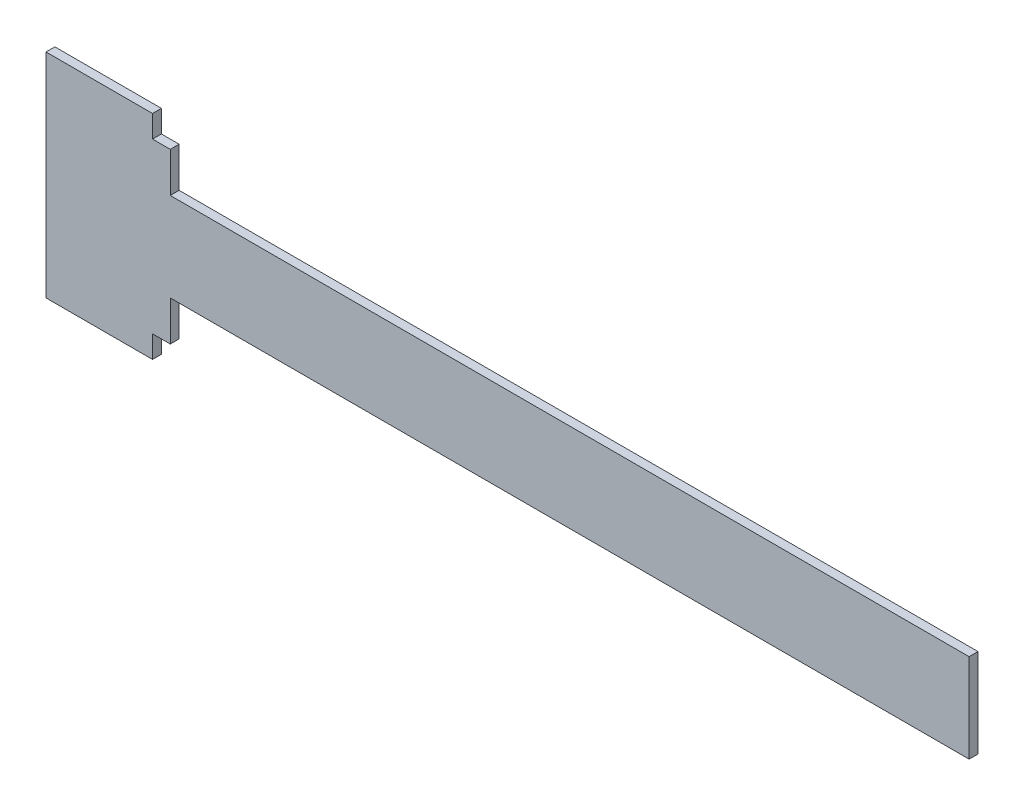
ISO-10303-21;
HEADER;
FILE_DESCRIPTION(('STEP AP214'),'2;1');
FILE_NAME('part.step','',(''),(''),'','','');
FILE_SCHEMA(('AUTOMOTIVE_DESIGN { 1 0 10303 214 1 1 1 1 }'));
ENDSEC;
DATA;
#1=APPLICATION_CONTEXT('core data for automotive mechanical design processes');
#2=APPLICATION_PROTOCOL_DEFINITION('international standard','automotive_design',2000,#1);
#3=PRODUCT_CONTEXT('',#1,'mechanical');
#4=PRODUCT('Part','Part','',(#3));
#5=PRODUCT_RELATED_PRODUCT_CATEGORY('part','',(#4));
#6=PRODUCT_DEFINITION_FORMATION('','',#4);
#7=PRODUCT_DEFINITION_CONTEXT('part definition',#1,'design');
#8=PRODUCT_DEFINITION('design','',#6,#7);
#9=PRODUCT_DEFINITION_SHAPE('','',#8);
#10=(LENGTH_UNIT() NAMED_UNIT(*) SI_UNIT(.MILLI.,.METRE.));
#11=(NAMED_UNIT(*) PLANE_ANGLE_UNIT() SI_UNIT($,.RADIAN.));
#12=(NAMED_UNIT(*) SI_UNIT($,.STERADIAN.) SOLID_ANGLE_UNIT());
#13=UNCERTAINTY_MEASURE_WITH_UNIT(LENGTH_MEASURE(1.E-05),#10,'distance_accuracy_value','');
#14=(GEOMETRIC_REPRESENTATION_CONTEXT(3) GLOBAL_UNCERTAINTY_ASSIGNED_CONTEXT((#13)) GLOBAL_UNIT_ASSIGNED_CONTEXT((#10,
#11,#12)) REPRESENTATION_CONTEXT('',''));
#15=CARTESIAN_POINT('',(0.,0.,0.));
#16=DIRECTION('',(0.,0.,1.));
#17=DIRECTION('',(1.,0.,0.));
#18=AXIS2_PLACEMENT_3D('',#15,#16,#17);
#19=CARTESIAN_POINT('',(-66.9761214574588,6.0224358974359,1.));
#20=DIRECTION('',(-1.,0.,0.));
#21=DIRECTION('',(0.,-1.,0.));
#22=AXIS2_PLACEMENT_3D('',#19,#20,#21);
#23=PLANE('',#22);
#24=DIRECTION('',(0.,1.,0.));
#25=VECTOR('',#24,1.);
#26=CARTESIAN_POINT('',(-66.9761214574588,6.0224358974359,0.));
#27=LINE('',#26,#25);
#28=CARTESIAN_POINT('',(-66.9761214574588,1.5224358974359,0.));
#29=VERTEX_POINT('',#28);
#30=CARTESIAN_POINT('',(-66.9761214574588,6.0224358974359,0.));
#31=VERTEX_POINT('',#30);
#32=EDGE_CURVE('E158',#29,#31,#27,.T.);
#33=ORIENTED_EDGE('',*,*,#32,.T.);
#34=DIRECTION('',(0.,0.,-1.));
#35=VECTOR('',#34,1.);
#36=CARTESIAN_POINT('',(-66.9761214574588,6.0224358974359,1.));
#37=LINE('',#36,#35);
#38=CARTESIAN_POINT('',(-66.9761214574588,6.0224358974359,1.));
#39=VERTEX_POINT('',#38);
#40=EDGE_CURVE('E11',#39,#31,#37,.T.);
#41=ORIENTED_EDGE('',*,*,#40,.F.);
#42=DIRECTION('',(0.,1.,0.));
#43=VECTOR('',#42,1.);
#44=CARTESIAN_POINT('',(-66.9761214574588,6.0224358974359,1.));
#45=LINE('',#44,#43);
#46=CARTESIAN_POINT('',(-66.9761214574588,1.5224358974359,1.));
#47=VERTEX_POINT('',#46);
#48=EDGE_CURVE('E180',#47,#39,#45,.T.);
#49=ORIENTED_EDGE('',*,*,#48,.F.);
#50=DIRECTION('',(0.,0.,-1.));
#51=VECTOR('',#50,1.);
#52=CARTESIAN_POINT('',(-66.9761214574588,1.5224358974359,1.));
#53=LINE('',#52,#51);
#54=EDGE_CURVE('E154',#47,#29,#53,.T.);
#55=ORIENTED_EDGE('',*,*,#54,.T.);
#56=EDGE_LOOP('',(#33,#41,#49,#55));
#57=FACE_BOUND('',#56,.T.);
#58=ADVANCED_FACE('F38',(#57),#23,.F.);
#59=CARTESIAN_POINT('',(-66.9761214574588,6.0224358974359,1.));
#60=DIRECTION('',(0.,1.,0.));
#61=DIRECTION('',(0.,0.,1.));
#62=AXIS2_PLACEMENT_3D('',#59,#60,#61);
#63=PLANE('',#62);
#64=DIRECTION('',(1.,0.,0.));
#65=VECTOR('',#64,1.);
#66=CARTESIAN_POINT('',(-66.9761214574588,6.0224358974359,0.));
#67=LINE('',#66,#65);
#68=CARTESIAN_POINT('',(23.0238785425412,6.0224358974359,0.));
#69=VERTEX_POINT('',#68);
#70=EDGE_CURVE('E161',#31,#69,#67,.T.);
#71=ORIENTED_EDGE('',*,*,#70,.T.);
#72=DIRECTION('',(0.,0.,-1.));
#73=VECTOR('',#72,1.);
#74=CARTESIAN_POINT('',(23.0238785425412,6.0224358974359,1.));
#75=LINE('',#74,#73);
#76=CARTESIAN_POINT('',(23.0238785425412,6.0224358974359,1.));
#77=VERTEX_POINT('',#76);
#78=EDGE_CURVE('E46',#77,#69,#75,.T.);
#79=ORIENTED_EDGE('',*,*,#78,.F.);
#80=DIRECTION('',(1.,0.,0.));
#81=VECTOR('',#80,1.);
#82=CARTESIAN_POINT('',(-66.9761214574588,6.0224358974359,1.));
#83=LINE('',#82,#81);
#84=EDGE_CURVE('E109',#39,#77,#83,.T.);
#85=ORIENTED_EDGE('',*,*,#84,.F.);
#86=ORIENTED_EDGE('',*,*,#40,.T.);
#87=EDGE_LOOP('',(#71,#79,#85,#86));
#88=FACE_BOUND('',#87,.T.);
#89=ADVANCED_FACE('F258',(#88),#63,.F.);
#90=CARTESIAN_POINT('',(23.0238785425412,16.0224358974359,1.));
#91=DIRECTION('',(-1.,0.,0.));
#92=DIRECTION('',(0.,-1.,0.));
#93=AXIS2_PLACEMENT_3D('',#90,#91,#92);
#94=PLANE('',#93);
#95=DIRECTION('',(0.,1.,0.));
#96=VECTOR('',#95,1.);
#97=CARTESIAN_POINT('',(23.0238785425412,16.0224358974359,0.));
#98=LINE('',#97,#96);
#99=CARTESIAN_POINT('',(23.0238785425412,16.0224358974359,0.));
#100=VERTEX_POINT('',#99);
#101=EDGE_CURVE('E163',#69,#100,#98,.T.);
#102=ORIENTED_EDGE('',*,*,#101,.T.);
#103=DIRECTION('',(0.,0.,-1.));
#104=VECTOR('',#103,1.);
#105=CARTESIAN_POINT('',(23.0238785425412,16.0224358974359,1.));
#106=LINE('',#105,#104);
#107=CARTESIAN_POINT('',(23.0238785425412,16.0224358974359,1.));
#108=VERTEX_POINT('',#107);
#109=EDGE_CURVE('E199',#108,#100,#106,.T.);
#110=ORIENTED_EDGE('',*,*,#109,.F.);
#111=DIRECTION('',(0.,1.,0.));
#112=VECTOR('',#111,1.);
#113=CARTESIAN_POINT('',(23.0238785425412,16.0224358974359,1.));
#114=LINE('',#113,#112);
#115=EDGE_CURVE('E207',#77,#108,#114,.T.);
#116=ORIENTED_EDGE('',*,*,#115,.F.);
#117=ORIENTED_EDGE('',*,*,#78,.T.);
#118=EDGE_LOOP('',(#102,#110,#116,#117));
#119=FACE_BOUND('',#118,.T.);
#120=ADVANCED_FACE('F205',(#119),#94,.F.);
#121=CARTESIAN_POINT('',(-66.9761214574588,16.0224358974359,1.));
#122=DIRECTION('',(0.,-1.,0.));
#123=DIRECTION('',(0.,0.,-1.));
#124=AXIS2_PLACEMENT_3D('',#121,#122,#123);
#125=PLANE('',#124);
#126=DIRECTION('',(-1.,0.,0.));
#127=VECTOR('',#126,1.);
#128=CARTESIAN_POINT('',(-66.9761214574588,16.0224358974359,0.));
#129=LINE('',#128,#127);
#130=CARTESIAN_POINT('',(-66.9761214574588,16.0224358974359,0.));
#131=VERTEX_POINT('',#130);
#132=EDGE_CURVE('E165',#100,#131,#129,.T.);
#133=ORIENTED_EDGE('',*,*,#132,.T.);
#134=DIRECTION('',(0.,0.,-1.));
#135=VECTOR('',#134,1.);
#136=CARTESIAN_POINT('',(-66.9761214574588,16.0224358974359,1.));
#137=LINE('',#136,#135);
#138=CARTESIAN_POINT('',(-66.9761214574588,16.0224358974359,1.));
#139=VERTEX_POINT('',#138);
#140=EDGE_CURVE('E196',#139,#131,#137,.T.);
#141=ORIENTED_EDGE('',*,*,#140,.F.);
#142=DIRECTION('',(-1.,0.,0.));
#143=VECTOR('',#142,1.);
#144=CARTESIAN_POINT('',(-66.9761214574588,16.0224358974359,1.));
#145=LINE('',#144,#143);
#146=EDGE_CURVE('E225',#108,#139,#145,.T.);
#147=ORIENTED_EDGE('',*,*,#146,.F.);
#148=ORIENTED_EDGE('',*,*,#109,.T.);
#149=EDGE_LOOP('',(#133,#141,#147,#148));
#150=FACE_BOUND('',#149,.T.);
#151=ADVANCED_FACE('F216',(#150),#125,.F.);
#152=CARTESIAN_POINT('',(-66.9761214574588,20.5224358974359,1.));
#153=DIRECTION('',(-1.,0.,0.));
#154=DIRECTION('',(0.,0.,1.));
#155=AXIS2_PLACEMENT_3D('',#152,#153,#154);
#156=PLANE('',#155);
#157=DIRECTION('',(0.,1.,0.));
#158=VECTOR('',#157,1.);
#159=CARTESIAN_POINT('',(-66.9761214574588,20.5224358974359,0.));
#160=LINE('',#159,#158);
#161=CARTESIAN_POINT('',(-66.9761214574588,20.5224358974359,0.));
#162=VERTEX_POINT('',#161);
#163=EDGE_CURVE('E167',#131,#162,#160,.T.);
#164=ORIENTED_EDGE('',*,*,#163,.T.);
#165=DIRECTION('',(0.,0.,-1.));
#166=VECTOR('',#165,1.);
#167=CARTESIAN_POINT('',(-66.9761214574588,20.5224358974359,1.));
#168=LINE('',#167,#166);
#169=CARTESIAN_POINT('',(-66.9761214574588,20.5224358974359,1.));
#170=VERTEX_POINT('',#169);
#171=EDGE_CURVE('E193',#170,#162,#168,.T.);
#172=ORIENTED_EDGE('',*,*,#171,.F.);
#173=DIRECTION('',(0.,1.,0.));
#174=VECTOR('',#173,1.);
#175=CARTESIAN_POINT('',(-66.9761214574588,20.5224358974359,1.));
#176=LINE('',#175,#174);
#177=EDGE_CURVE('E222',#139,#170,#176,.T.);
#178=ORIENTED_EDGE('',*,*,#177,.F.);
#179=ORIENTED_EDGE('',*,*,#140,.T.);
#180=EDGE_LOOP('',(#164,#172,#178,#179));
#181=FACE_BOUND('',#180,.T.);
#182=ADVANCED_FACE('F220',(#181),#156,.F.);
#183=CARTESIAN_POINT('',(-68.9761214574588,20.5224358974359,1.));
#184=DIRECTION('',(0.,-1.,0.));
#185=DIRECTION('',(0.,0.,-1.));
#186=AXIS2_PLACEMENT_3D('',#183,#184,#185);
#187=PLANE('',#186);
#188=DIRECTION('',(-1.,0.,0.));
#189=VECTOR('',#188,1.);
#190=CARTESIAN_POINT('',(-68.9761214574588,20.5224358974359,0.));
#191=LINE('',#190,#189);
#192=CARTESIAN_POINT('',(-68.9761214574588,20.5224358974359,0.));
#193=VERTEX_POINT('',#192);
#194=EDGE_CURVE('E169',#162,#193,#191,.T.);
#195=ORIENTED_EDGE('',*,*,#194,.T.);
#196=DIRECTION('',(0.,0.,-1.));
#197=VECTOR('',#196,1.);
#198=CARTESIAN_POINT('',(-68.9761214574588,20.5224358974359,1.));
#199=LINE('',#198,#197);
#200=CARTESIAN_POINT('',(-68.9761214574588,20.5224358974359,1.));
#201=VERTEX_POINT('',#200);
#202=EDGE_CURVE('E190',#201,#193,#199,.T.);
#203=ORIENTED_EDGE('',*,*,#202,.F.);
#204=DIRECTION('',(-1.,0.,0.));
#205=VECTOR('',#204,1.);
#206=CARTESIAN_POINT('',(-68.9761214574588,20.5224358974359,1.));
#207=LINE('',#206,#205);
#208=EDGE_CURVE('E224',#170,#201,#207,.T.);
#209=ORIENTED_EDGE('',*,*,#208,.F.);
#210=ORIENTED_EDGE('',*,*,#171,.T.);
#211=EDGE_LOOP('',(#195,#203,#209,#210));
#212=FACE_BOUND('',#211,.T.);
#213=ADVANCED_FACE('F271',(#212),#187,.F.);
#214=CARTESIAN_POINT('',(-68.9761214574588,23.0224358974359,1.));
#215=DIRECTION('',(-1.,0.,0.));
#216=DIRECTION('',(0.,0.,1.));
#217=AXIS2_PLACEMENT_3D('',#214,#215,#216);
#218=PLANE('',#217);
#219=DIRECTION('',(0.,1.,0.));
#220=VECTOR('',#219,1.);
#221=CARTESIAN_POINT('',(-68.9761214574588,23.0224358974359,0.));
#222=LINE('',#221,#220);
#223=CARTESIAN_POINT('',(-68.9761214574588,23.0224358974359,0.));
#224=VERTEX_POINT('',#223);
#225=EDGE_CURVE('E171',#193,#224,#222,.T.);
#226=ORIENTED_EDGE('',*,*,#225,.T.);
#227=DIRECTION('',(0.,0.,-1.));
#228=VECTOR('',#227,1.);
#229=CARTESIAN_POINT('',(-68.9761214574588,23.0224358974359,1.));
#230=LINE('',#229,#228);
#231=CARTESIAN_POINT('',(-68.9761214574588,23.0224358974359,1.));
#232=VERTEX_POINT('',#231);
#233=EDGE_CURVE('E187',#232,#224,#230,.T.);
#234=ORIENTED_EDGE('',*,*,#233,.F.);
#235=DIRECTION('',(0.,1.,0.));
#236=VECTOR('',#235,1.);
#237=CARTESIAN_POINT('',(-68.9761214574588,23.0224358974359,1.));
#238=LINE('',#237,#236);
#239=EDGE_CURVE('E227',#201,#232,#238,.T.);
#240=ORIENTED_EDGE('',*,*,#239,.F.);
#241=ORIENTED_EDGE('',*,*,#202,.T.);
#242=EDGE_LOOP('',(#226,#234,#240,#241));
#243=FACE_BOUND('',#242,.T.);
#244=ADVANCED_FACE('F274',(#243),#218,.F.);
#245=CARTESIAN_POINT('',(-80.9761214574588,23.0224358974359,1.));
#246=DIRECTION('',(0.,-1.,0.));
#247=DIRECTION('',(0.,0.,-1.));
#248=AXIS2_PLACEMENT_3D('',#245,#246,#247);
#249=PLANE('',#248);
#250=DIRECTION('',(-1.,0.,0.));
#251=VECTOR('',#250,1.);
#252=CARTESIAN_POINT('',(-80.9761214574588,23.0224358974359,0.));
#253=LINE('',#252,#251);
#254=CARTESIAN_POINT('',(-80.9761214574588,23.0224358974359,0.));
#255=VERTEX_POINT('',#254);
#256=EDGE_CURVE('E173',#224,#255,#253,.T.);
#257=ORIENTED_EDGE('',*,*,#256,.T.);
#258=DIRECTION('',(0.,0.,-1.));
#259=VECTOR('',#258,1.);
#260=CARTESIAN_POINT('',(-80.9761214574588,23.0224358974359,1.));
#261=LINE('',#260,#259);
#262=CARTESIAN_POINT('',(-80.9761214574588,23.0224358974359,1.));
#263=VERTEX_POINT('',#262);
#264=EDGE_CURVE('E184',#263,#255,#261,.T.);
#265=ORIENTED_EDGE('',*,*,#264,.F.);
#266=DIRECTION('',(-1.,0.,0.));
#267=VECTOR('',#266,1.);
#268=CARTESIAN_POINT('',(-80.9761214574588,23.0224358974359,1.));
#269=LINE('',#268,#267);
#270=EDGE_CURVE('E233',#232,#263,#269,.T.);
#271=ORIENTED_EDGE('',*,*,#270,.F.);
#272=ORIENTED_EDGE('',*,*,#233,.T.);
#273=EDGE_LOOP('',(#257,#265,#271,#272));
#274=FACE_BOUND('',#273,.T.);
#275=ADVANCED_FACE('F239',(#274),#249,.F.);
#276=CARTESIAN_POINT('',(-80.9761214574588,23.0224358974359,1.));
#277=DIRECTION('',(1.,0.,0.));
#278=DIRECTION('',(0.,0.,-1.));
#279=AXIS2_PLACEMENT_3D('',#276,#277,#278);
#280=PLANE('',#279);
#281=DIRECTION('',(0.,-1.,0.));
#282=VECTOR('',#281,1.);
#283=CARTESIAN_POINT('',(-80.9761214574588,23.0224358974359,0.));
#284=LINE('',#283,#282);
#285=CARTESIAN_POINT('',(-80.9761214574588,-0.9775641025641,0.));
#286=VERTEX_POINT('',#285);
#287=EDGE_CURVE('E175',#255,#286,#284,.T.);
#288=ORIENTED_EDGE('',*,*,#287,.T.);
#289=DIRECTION('',(0.,0.,-1.));
#290=VECTOR('',#289,1.);
#291=CARTESIAN_POINT('',(-80.9761214574588,-0.9775641025641,1.));
#292=LINE('',#291,#290);
#293=CARTESIAN_POINT('',(-80.9761214574588,-0.9775641025641,1.));
#294=VERTEX_POINT('',#293);
#295=EDGE_CURVE('E149',#294,#286,#292,.T.);
#296=ORIENTED_EDGE('',*,*,#295,.F.);
#297=DIRECTION('',(0.,-1.,0.));
#298=VECTOR('',#297,1.);
#299=CARTESIAN_POINT('',(-80.9761214574588,23.0224358974359,1.));
#300=LINE('',#299,#298);
#301=EDGE_CURVE('E140',#263,#294,#300,.T.);
#302=ORIENTED_EDGE('',*,*,#301,.F.);
#303=ORIENTED_EDGE('',*,*,#264,.T.);
#304=EDGE_LOOP('',(#288,#296,#302,#303));
#305=FACE_BOUND('',#304,.T.);
#306=ADVANCED_FACE('F243',(#305),#280,.F.);
#307=CARTESIAN_POINT('',(-80.9761214574588,-0.9775641025641,1.));
#308=DIRECTION('',(0.,1.,0.));
#309=DIRECTION('',(0.,0.,1.));
#310=AXIS2_PLACEMENT_3D('',#307,#308,#309);
#311=PLANE('',#310);
#312=DIRECTION('',(1.,0.,0.));
#313=VECTOR('',#312,1.);
#314=CARTESIAN_POINT('',(-80.9761214574588,-0.9775641025641,0.));
#315=LINE('',#314,#313);
#316=CARTESIAN_POINT('',(-68.9761214574588,-0.9775641025641,0.));
#317=VERTEX_POINT('',#316);
#318=EDGE_CURVE('E148',#286,#317,#315,.T.);
#319=ORIENTED_EDGE('',*,*,#318,.T.);
#320=DIRECTION('',(0.,0.,-1.));
#321=VECTOR('',#320,1.);
#322=CARTESIAN_POINT('',(-68.9761214574588,-0.9775641025641,1.));
#323=LINE('',#322,#321);
#324=CARTESIAN_POINT('',(-68.9761214574588,-0.9775641025641,1.));
#325=VERTEX_POINT('',#324);
#326=EDGE_CURVE('E145',#325,#317,#323,.T.);
#327=ORIENTED_EDGE('',*,*,#326,.F.);
#328=DIRECTION('',(1.,0.,0.));
#329=VECTOR('',#328,1.);
#330=CARTESIAN_POINT('',(-80.9761214574588,-0.9775641025641,1.));
#331=LINE('',#330,#329);
#332=EDGE_CURVE('E134',#294,#325,#331,.T.);
#333=ORIENTED_EDGE('',*,*,#332,.F.);
#334=ORIENTED_EDGE('',*,*,#295,.T.);
#335=EDGE_LOOP('',(#319,#327,#333,#334));
#336=FACE_BOUND('',#335,.T.);
#337=ADVANCED_FACE('F146',(#336),#311,.F.);
#338=CARTESIAN_POINT('',(-68.9761214574588,1.5224358974359,1.));
#339=DIRECTION('',(-1.,0.,0.));
#340=DIRECTION('',(0.,0.,1.));
#341=AXIS2_PLACEMENT_3D('',#338,#339,#340);
#342=PLANE('',#341);
#343=DIRECTION('',(0.,1.,0.));
#344=VECTOR('',#343,1.);
#345=CARTESIAN_POINT('',(-68.9761214574588,1.5224358974359,0.));
#346=LINE('',#345,#344);
#347=CARTESIAN_POINT('',(-68.9761214574588,1.5224358974359,0.));
#348=VERTEX_POINT('',#347);
#349=EDGE_CURVE('E95',#317,#348,#346,.T.);
#350=ORIENTED_EDGE('',*,*,#349,.T.);
#351=DIRECTION('',(0.,0.,-1.));
#352=VECTOR('',#351,1.);
#353=CARTESIAN_POINT('',(-68.9761214574588,1.5224358974359,1.));
#354=LINE('',#353,#352);
#355=CARTESIAN_POINT('',(-68.9761214574588,1.5224358974359,1.));
#356=VERTEX_POINT('',#355);
#357=EDGE_CURVE('E150',#356,#348,#354,.T.);
#358=ORIENTED_EDGE('',*,*,#357,.F.);
#359=DIRECTION('',(0.,1.,0.));
#360=VECTOR('',#359,1.);
#361=CARTESIAN_POINT('',(-68.9761214574588,1.5224358974359,1.));
#362=LINE('',#361,#360);
#363=EDGE_CURVE('E138',#325,#356,#362,.T.);
#364=ORIENTED_EDGE('',*,*,#363,.F.);
#365=ORIENTED_EDGE('',*,*,#326,.T.);
#366=EDGE_LOOP('',(#350,#358,#364,#365));
#367=FACE_BOUND('',#366,.T.);
#368=ADVANCED_FACE('F152',(#367),#342,.F.);
#369=CARTESIAN_POINT('',(-68.9761214574588,1.5224358974359,1.));
#370=DIRECTION('',(0.,1.,0.));
#371=DIRECTION('',(0.,0.,1.));
#372=AXIS2_PLACEMENT_3D('',#369,#370,#371);
#373=PLANE('',#372);
#374=DIRECTION('',(1.,0.,0.));
#375=VECTOR('',#374,1.);
#376=CARTESIAN_POINT('',(-68.9761214574588,1.5224358974359,0.));
#377=LINE('',#376,#375);
#378=EDGE_CURVE('E101',#348,#29,#377,.T.);
#379=ORIENTED_EDGE('',*,*,#378,.T.);
#380=ORIENTED_EDGE('',*,*,#54,.F.);
#381=DIRECTION('',(1.,0.,0.));
#382=VECTOR('',#381,1.);
#383=CARTESIAN_POINT('',(-68.9761214574588,1.5224358974359,1.));
#384=LINE('',#383,#382);
#385=EDGE_CURVE('E54',#356,#47,#384,.T.);
#386=ORIENTED_EDGE('',*,*,#385,.F.);
#387=ORIENTED_EDGE('',*,*,#357,.T.);
#388=EDGE_LOOP('',(#379,#380,#386,#387));
#389=FACE_BOUND('',#388,.T.);
#390=ADVANCED_FACE('F247',(#389),#373,.F.);
#391=CARTESIAN_POINT('',(0.,0.,1.));
#392=DIRECTION('',(0.,0.,1.));
#393=DIRECTION('',(1.,0.,0.));
#394=AXIS2_PLACEMENT_3D('',#391,#392,#393);
#395=PLANE('',#394);
#396=ORIENTED_EDGE('',*,*,#48,.T.);
#397=ORIENTED_EDGE('',*,*,#84,.T.);
#398=ORIENTED_EDGE('',*,*,#115,.T.);
#399=ORIENTED_EDGE('',*,*,#146,.T.);
#400=ORIENTED_EDGE('',*,*,#177,.T.);
#401=ORIENTED_EDGE('',*,*,#208,.T.);
#402=ORIENTED_EDGE('',*,*,#239,.T.);
#403=ORIENTED_EDGE('',*,*,#270,.T.);
#404=ORIENTED_EDGE('',*,*,#301,.T.);
#405=ORIENTED_EDGE('',*,*,#332,.T.);
#406=ORIENTED_EDGE('',*,*,#363,.T.);
#407=ORIENTED_EDGE('',*,*,#385,.T.);
#408=EDGE_LOOP('',(#396,#397,#398,#399,#400,#401,#402,#403,#404,#405,#406,#407));
#409=FACE_BOUND('',#408,.T.);
#410=ADVANCED_FACE('F136',(#409),#395,.T.);
#411=CARTESIAN_POINT('',(0.,0.,0.));
#412=DIRECTION('',(0.,0.,1.));
#413=DIRECTION('',(1.,0.,0.));
#414=AXIS2_PLACEMENT_3D('',#411,#412,#413);
#415=PLANE('',#414);
#416=ORIENTED_EDGE('',*,*,#32,.F.);
#417=ORIENTED_EDGE('',*,*,#378,.F.);
#418=ORIENTED_EDGE('',*,*,#349,.F.);
#419=ORIENTED_EDGE('',*,*,#318,.F.);
#420=ORIENTED_EDGE('',*,*,#287,.F.);
#421=ORIENTED_EDGE('',*,*,#256,.F.);
#422=ORIENTED_EDGE('',*,*,#225,.F.);
#423=ORIENTED_EDGE('',*,*,#194,.F.);
#424=ORIENTED_EDGE('',*,*,#163,.F.);
#425=ORIENTED_EDGE('',*,*,#132,.F.);
#426=ORIENTED_EDGE('',*,*,#101,.F.);
#427=ORIENTED_EDGE('',*,*,#70,.F.);
#428=EDGE_LOOP('',(#416,#417,#418,#419,#420,#421,#422,#423,#424,#425,#426,#427));
#429=FACE_BOUND('',#428,.T.);
#430=ADVANCED_FACE('F211',(#429),#415,.F.);
#431=CLOSED_SHELL('',(#58,#89,#120,#151,#182,#213,#244,#275,#306,#337,#368,#390,#410,#430));
#432=MANIFOLD_SOLID_BREP('B2',#431);
#433=ADVANCED_BREP_SHAPE_REPRESENTATION('',(#18,#432),#14);
#434=SHAPE_DEFINITION_REPRESENTATION(#9,#433);
ENDSEC;
END-ISO-10303-21;
